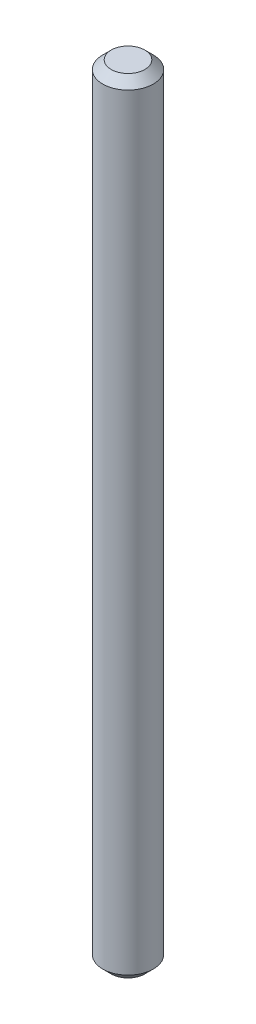
ISO-10303-21;
HEADER;
FILE_DESCRIPTION(('STEP AP214'),'2;1');
FILE_NAME('part.step','',(''),(''),'','','');
FILE_SCHEMA(('AUTOMOTIVE_DESIGN { 1 0 10303 214 1 1 1 1 }'));
ENDSEC;
DATA;
#1=APPLICATION_CONTEXT('core data for automotive mechanical design processes');
#2=APPLICATION_PROTOCOL_DEFINITION('international standard','automotive_design',2000,#1);
#3=PRODUCT_CONTEXT('',#1,'mechanical');
#4=PRODUCT('Part','Part','',(#3));
#5=PRODUCT_RELATED_PRODUCT_CATEGORY('part','',(#4));
#6=PRODUCT_DEFINITION_FORMATION('','',#4);
#7=PRODUCT_DEFINITION_CONTEXT('part definition',#1,'design');
#8=PRODUCT_DEFINITION('design','',#6,#7);
#9=PRODUCT_DEFINITION_SHAPE('','',#8);
#10=(LENGTH_UNIT() NAMED_UNIT(*) SI_UNIT(.MILLI.,.METRE.));
#11=(NAMED_UNIT(*) PLANE_ANGLE_UNIT() SI_UNIT($,.RADIAN.));
#12=(NAMED_UNIT(*) SI_UNIT($,.STERADIAN.) SOLID_ANGLE_UNIT());
#13=UNCERTAINTY_MEASURE_WITH_UNIT(LENGTH_MEASURE(1.E-05),#10,'distance_accuracy_value','');
#14=(GEOMETRIC_REPRESENTATION_CONTEXT(3) GLOBAL_UNCERTAINTY_ASSIGNED_CONTEXT((#13)) GLOBAL_UNIT_ASSIGNED_CONTEXT((#10,
#11,#12)) REPRESENTATION_CONTEXT('',''));
#15=CARTESIAN_POINT('',(0.,0.,0.));
#16=DIRECTION('',(0.,0.,1.));
#17=DIRECTION('',(1.,0.,0.));
#18=AXIS2_PLACEMENT_3D('',#15,#16,#17);
#19=CARTESIAN_POINT('',(0.,93.,0.));
#20=DIRECTION('',(0.,1.,0.));
#21=DIRECTION('',(0.,0.,1.));
#22=AXIS2_PLACEMENT_3D('',#19,#20,#21);
#23=PLANE('',#22);
#24=CARTESIAN_POINT('',(0.,93.,0.));
#25=DIRECTION('',(0.,1.,0.));
#26=DIRECTION('',(0.,0.,1.));
#27=AXIS2_PLACEMENT_3D('',#24,#25,#26);
#28=CIRCLE('',#27,1.99999999999999);
#29=CARTESIAN_POINT('',(0.,93.,1.99999999999999));
#30=VERTEX_POINT('',#29);
#31=EDGE_CURVE('E10',#30,#30,#28,.T.);
#32=ORIENTED_EDGE('',*,*,#31,.T.);
#33=EDGE_LOOP('',(#32));
#34=FACE_BOUND('',#33,.T.);
#35=ADVANCED_FACE('F35',(#34),#23,.T.);
#36=CARTESIAN_POINT('',(0.,0.,0.));
#37=DIRECTION('',(0.,-1.,0.));
#38=DIRECTION('',(0.,0.,-1.));
#39=AXIS2_PLACEMENT_3D('',#36,#37,#38);
#40=CYLINDRICAL_SURFACE('',#39,3.);
#41=CARTESIAN_POINT('',(0.,0.999999999999995,0.));
#42=DIRECTION('',(0.,-1.,0.));
#43=DIRECTION('',(0.,0.,-1.));
#44=AXIS2_PLACEMENT_3D('',#41,#42,#43);
#45=CIRCLE('',#44,3.);
#46=CARTESIAN_POINT('',(0.,0.999999999999995,-3.));
#47=VERTEX_POINT('',#46);
#48=EDGE_CURVE('E43',#47,#47,#45,.F.);
#49=ORIENTED_EDGE('',*,*,#48,.T.);
#50=EDGE_LOOP('',(#49));
#51=FACE_BOUND('',#50,.T.);
#52=CARTESIAN_POINT('',(0.,92.,0.));
#53=DIRECTION('',(0.,1.,0.));
#54=DIRECTION('',(0.,0.,1.));
#55=AXIS2_PLACEMENT_3D('',#52,#53,#54);
#56=CIRCLE('',#55,3.);
#57=CARTESIAN_POINT('',(0.,92.,3.));
#58=VERTEX_POINT('',#57);
#59=EDGE_CURVE('E47',#58,#58,#56,.F.);
#60=ORIENTED_EDGE('',*,*,#59,.T.);
#61=EDGE_LOOP('',(#60));
#62=FACE_BOUND('',#61,.T.);
#63=ADVANCED_FACE('F67',(#51,#62),#40,.T.);
#64=CARTESIAN_POINT('',(0.,0.,0.));
#65=DIRECTION('',(0.,-1.,0.));
#66=DIRECTION('',(0.,0.,-1.));
#67=AXIS2_PLACEMENT_3D('',#64,#65,#66);
#68=PLANE('',#67);
#69=CARTESIAN_POINT('',(0.,0.,0.));
#70=DIRECTION('',(0.,-1.,0.));
#71=DIRECTION('',(0.,0.,-1.));
#72=AXIS2_PLACEMENT_3D('',#69,#70,#71);
#73=CIRCLE('',#72,2.00000000000002);
#74=CARTESIAN_POINT('',(0.,0.,-2.00000000000002));
#75=VERTEX_POINT('',#74);
#76=EDGE_CURVE('E51',#75,#75,#73,.T.);
#77=ORIENTED_EDGE('',*,*,#76,.T.);
#78=EDGE_LOOP('',(#77));
#79=FACE_BOUND('',#78,.T.);
#80=ADVANCED_FACE('F57',(#79),#68,.T.);
#81=CARTESIAN_POINT('',(0.,0.,0.));
#82=DIRECTION('',(0.,1.,0.));
#83=DIRECTION('',(0.,0.,1.));
#84=AXIS2_PLACEMENT_3D('',#81,#82,#83);
#85=CONICAL_SURFACE('',#84,2.00000000000002,0.785398163397443);
#86=ORIENTED_EDGE('',*,*,#48,.F.);
#87=EDGE_LOOP('',(#86));
#88=FACE_BOUND('',#87,.T.);
#89=ORIENTED_EDGE('',*,*,#76,.F.);
#90=EDGE_LOOP('',(#89));
#91=FACE_BOUND('',#90,.T.);
#92=ADVANCED_FACE('F59',(#88,#91),#85,.T.);
#93=CARTESIAN_POINT('',(0.,92.,0.));
#94=DIRECTION('',(0.,-1.,0.));
#95=DIRECTION('',(0.,0.,-1.));
#96=AXIS2_PLACEMENT_3D('',#93,#94,#95);
#97=CONICAL_SURFACE('',#96,3.,0.78539816339744);
#98=ORIENTED_EDGE('',*,*,#31,.F.);
#99=EDGE_LOOP('',(#98));
#100=FACE_BOUND('',#99,.T.);
#101=ORIENTED_EDGE('',*,*,#59,.F.);
#102=EDGE_LOOP('',(#101));
#103=FACE_BOUND('',#102,.T.);
#104=ADVANCED_FACE('F38',(#100,#103),#97,.T.);
#105=CLOSED_SHELL('',(#35,#63,#80,#92,#104));
#106=MANIFOLD_SOLID_BREP('B2',#105);
#107=ADVANCED_BREP_SHAPE_REPRESENTATION('',(#18,#106),#14);
#108=SHAPE_DEFINITION_REPRESENTATION(#9,#107);
ENDSEC;
END-ISO-10303-21;
